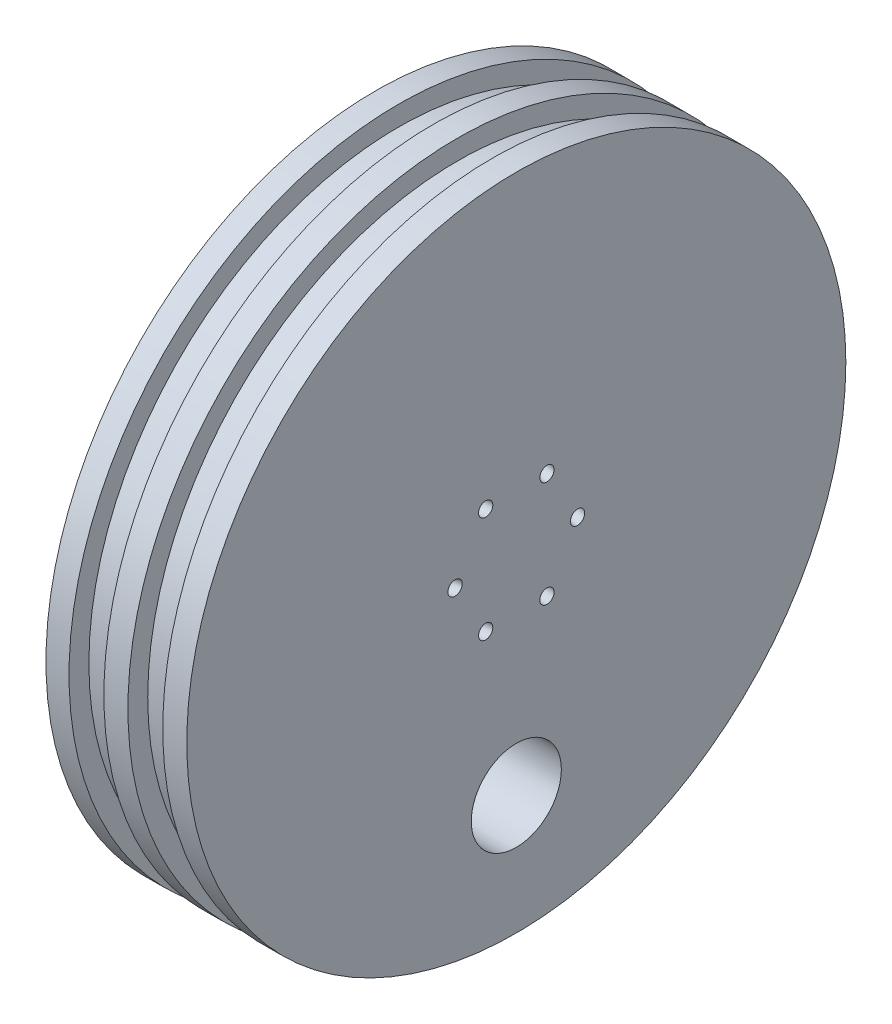
ISO-10303-21;
HEADER;
FILE_DESCRIPTION(('STEP AP214'),'2;1');
FILE_NAME('part.step','',(''),(''),'','','');
FILE_SCHEMA(('AUTOMOTIVE_DESIGN { 1 0 10303 214 1 1 1 1 }'));
ENDSEC;
DATA;
#1=APPLICATION_CONTEXT('core data for automotive mechanical design processes');
#2=APPLICATION_PROTOCOL_DEFINITION('international standard','automotive_design',2000,#1);
#3=PRODUCT_CONTEXT('',#1,'mechanical');
#4=PRODUCT('Part','Part','',(#3));
#5=PRODUCT_RELATED_PRODUCT_CATEGORY('part','',(#4));
#6=PRODUCT_DEFINITION_FORMATION('','',#4);
#7=PRODUCT_DEFINITION_CONTEXT('part definition',#1,'design');
#8=PRODUCT_DEFINITION('design','',#6,#7);
#9=PRODUCT_DEFINITION_SHAPE('','',#8);
#10=(LENGTH_UNIT() NAMED_UNIT(*) SI_UNIT(.MILLI.,.METRE.));
#11=(NAMED_UNIT(*) PLANE_ANGLE_UNIT() SI_UNIT($,.RADIAN.));
#12=(NAMED_UNIT(*) SI_UNIT($,.STERADIAN.) SOLID_ANGLE_UNIT());
#13=UNCERTAINTY_MEASURE_WITH_UNIT(LENGTH_MEASURE(1.E-05),#10,'distance_accuracy_value','');
#14=(GEOMETRIC_REPRESENTATION_CONTEXT(3) GLOBAL_UNCERTAINTY_ASSIGNED_CONTEXT((#13)) GLOBAL_UNIT_ASSIGNED_CONTEXT((#10,
#11,#12)) REPRESENTATION_CONTEXT('',''));
#15=CARTESIAN_POINT('',(0.,0.,0.));
#16=DIRECTION('',(0.,0.,1.));
#17=DIRECTION('',(1.,0.,0.));
#18=AXIS2_PLACEMENT_3D('',#15,#16,#17);
#19=CARTESIAN_POINT('',(-18.06,0.,0.));
#20=DIRECTION('',(-1.,0.,0.));
#21=DIRECTION('',(0.,0.,1.));
#22=AXIS2_PLACEMENT_3D('',#19,#20,#21);
#23=PLANE('',#22);
#24=CARTESIAN_POINT('',(-18.06,-22.225,-1.52655665885959E-13));
#25=DIRECTION('',(-1.,0.,0.));
#26=DIRECTION('',(0.,0.,1.));
#27=AXIS2_PLACEMENT_3D('',#24,#25,#26);
#28=CIRCLE('',#27,4.21639999999999);
#29=CARTESIAN_POINT('',(-18.06,-22.225,4.21639999999984));
#30=VERTEX_POINT('',#29);
#31=EDGE_CURVE('E82',#30,#30,#28,.T.);
#32=ORIENTED_EDGE('',*,*,#31,.F.);
#33=EDGE_LOOP('',(#32));
#34=FACE_BOUND('',#33,.T.);
#35=CARTESIAN_POINT('',(-18.06,11.3347499999999,19.6323628910914));
#36=DIRECTION('',(-1.,0.,0.));
#37=DIRECTION('',(0.,0.,1.));
#38=AXIS2_PLACEMENT_3D('',#35,#36,#37);
#39=CIRCLE('',#38,0.888999999999989);
#40=CARTESIAN_POINT('',(-18.06,11.3347499999999,20.5213628910913));
#41=VERTEX_POINT('',#40);
#42=EDGE_CURVE('E76',#41,#41,#39,.T.);
#43=ORIENTED_EDGE('',*,*,#42,.F.);
#44=EDGE_LOOP('',(#43));
#45=FACE_BOUND('',#44,.T.);
#46=CARTESIAN_POINT('',(-18.06,-7.03945803644227,-5.71569897686727));
#47=DIRECTION('',(-1.,0.,0.));
#48=DIRECTION('',(0.,0.499999999999989,0.866025403784445));
#49=AXIS2_PLACEMENT_3D('',#46,#47,#48);
#50=ELLIPSE('',#49,0.759348844340994,0.749999999999992);
#51=CARTESIAN_POINT('',(-18.06,-6.65978361427178,-5.05808358733361));
#52=VERTEX_POINT('',#51);
#53=EDGE_CURVE('E88',#52,#52,#50,.F.);
#54=ORIENTED_EDGE('',*,*,#53,.T.);
#55=EDGE_LOOP('',(#54));
#56=FACE_BOUND('',#55,.T.);
#57=CARTESIAN_POINT('',(-18.06,-8.4696695325729,3.23849999999995));
#58=DIRECTION('',(-1.,0.,0.));
#59=DIRECTION('',(0.,1.,0.));
#60=AXIS2_PLACEMENT_3D('',#57,#58,#59);
#61=ELLIPSE('',#60,0.759348844340993,0.749999999999991);
#62=CARTESIAN_POINT('',(-18.06,-7.71032068823191,3.23849999999995));
#63=VERTEX_POINT('',#62);
#64=EDGE_CURVE('E92',#63,#63,#61,.F.);
#65=ORIENTED_EDGE('',*,*,#64,.T.);
#66=EDGE_LOOP('',(#65));
#67=FACE_BOUND('',#66,.T.);
#68=CARTESIAN_POINT('',(-18.06,0.,0.));
#69=DIRECTION('',(1.,0.,0.));
#70=DIRECTION('',(0.,0.,-1.));
#71=AXIS2_PLACEMENT_3D('',#68,#69,#70);
#72=CIRCLE('',#71,29.1592);
#73=CARTESIAN_POINT('',(-18.06,0.,-29.1592));
#74=VERTEX_POINT('',#73);
#75=EDGE_CURVE('E48',#74,#74,#72,.T.);
#76=ORIENTED_EDGE('',*,*,#75,.F.);
#77=EDGE_LOOP('',(#76));
#78=FACE_BOUND('',#77,.T.);
#79=CARTESIAN_POINT('',(-18.06,0.,0.));
#80=DIRECTION('',(1.,0.,0.));
#81=DIRECTION('',(0.,0.,-1.));
#82=AXIS2_PLACEMENT_3D('',#79,#80,#81);
#83=CIRCLE('',#82,4.7625);
#84=CARTESIAN_POINT('',(-18.06,0.,-4.7625));
#85=VERTEX_POINT('',#84);
#86=EDGE_CURVE('E169',#85,#85,#83,.T.);
#87=ORIENTED_EDGE('',*,*,#86,.T.);
#88=EDGE_LOOP('',(#87));
#89=FACE_BOUND('',#88,.T.);
#90=CARTESIAN_POINT('',(-18.06,22.225,0.));
#91=DIRECTION('',(-1.,0.,0.));
#92=DIRECTION('',(0.,0.,1.));
#93=AXIS2_PLACEMENT_3D('',#90,#91,#92);
#94=CIRCLE('',#93,2.0447);
#95=CARTESIAN_POINT('',(-18.06,22.225,2.0447));
#96=VERTEX_POINT('',#95);
#97=EDGE_CURVE('E130',#96,#96,#94,.T.);
#98=ORIENTED_EDGE('',*,*,#97,.F.);
#99=EDGE_LOOP('',(#98));
#100=FACE_BOUND('',#99,.T.);
#101=CARTESIAN_POINT('',(-18.06,-11.1125000000001,19.2474145991091));
#102=DIRECTION('',(-1.,0.,0.));
#103=DIRECTION('',(0.,0.,1.));
#104=AXIS2_PLACEMENT_3D('',#101,#102,#103);
#105=CIRCLE('',#104,2.0447);
#106=CARTESIAN_POINT('',(-18.06,-11.1125000000001,21.2921145991091));
#107=VERTEX_POINT('',#106);
#108=EDGE_CURVE('E124',#107,#107,#105,.T.);
#109=ORIENTED_EDGE('',*,*,#108,.F.);
#110=EDGE_LOOP('',(#109));
#111=FACE_BOUND('',#110,.T.);
#112=CARTESIAN_POINT('',(-18.06,-11.1124999999998,-19.2474145991092));
#113=DIRECTION('',(-1.,0.,0.));
#114=DIRECTION('',(0.,0.,1.));
#115=AXIS2_PLACEMENT_3D('',#112,#113,#114);
#116=CIRCLE('',#115,2.0447);
#117=CARTESIAN_POINT('',(-18.06,-11.1124999999998,-17.2027145991092));
#118=VERTEX_POINT('',#117);
#119=EDGE_CURVE('E118',#118,#118,#116,.T.);
#120=ORIENTED_EDGE('',*,*,#119,.F.);
#121=EDGE_LOOP('',(#120));
#122=FACE_BOUND('',#121,.T.);
#123=CARTESIAN_POINT('',(-18.06,1.43021149613054,-8.95419897686718));
#124=DIRECTION('',(-1.,0.,0.));
#125=DIRECTION('',(0.,-0.500000000000001,0.866025403784438));
#126=AXIS2_PLACEMENT_3D('',#123,#124,#125);
#127=ELLIPSE('',#126,0.759348844340993,0.749999999999991);
#128=CARTESIAN_POINT('',(-18.06,1.05053707396004,-8.29658358733353));
#129=VERTEX_POINT('',#128);
#130=EDGE_CURVE('E112',#129,#129,#127,.F.);
#131=ORIENTED_EDGE('',*,*,#130,.T.);
#132=EDGE_LOOP('',(#131));
#133=FACE_BOUND('',#132,.T.);
#134=CARTESIAN_POINT('',(-18.06,8.46966953257289,-3.23849999999999));
#135=DIRECTION('',(-1.,0.,0.));
#136=DIRECTION('',(0.,-1.,0.));
#137=AXIS2_PLACEMENT_3D('',#134,#135,#136);
#138=ELLIPSE('',#137,0.759348844340993,0.749999999999991);
#139=CARTESIAN_POINT('',(-18.06,7.71032068823189,-3.23849999999999));
#140=VERTEX_POINT('',#139);
#141=EDGE_CURVE('E106',#140,#140,#138,.F.);
#142=ORIENTED_EDGE('',*,*,#141,.T.);
#143=EDGE_LOOP('',(#142));
#144=FACE_BOUND('',#143,.T.);
#145=CARTESIAN_POINT('',(-18.06,7.03945803644231,5.71569897686722));
#146=DIRECTION('',(-1.,0.,0.));
#147=DIRECTION('',(0.,-0.499999999999995,-0.866025403784442));
#148=AXIS2_PLACEMENT_3D('',#145,#146,#147);
#149=ELLIPSE('',#148,0.759348844340994,0.749999999999992);
#150=CARTESIAN_POINT('',(-18.06,6.65978361427182,5.05808358733356));
#151=VERTEX_POINT('',#150);
#152=EDGE_CURVE('E102',#151,#151,#149,.F.);
#153=ORIENTED_EDGE('',*,*,#152,.T.);
#154=EDGE_LOOP('',(#153));
#155=FACE_BOUND('',#154,.T.);
#156=CARTESIAN_POINT('',(-18.06,-1.43021149613054,8.95419897686718));
#157=DIRECTION('',(-1.,0.,0.));
#158=DIRECTION('',(0.,0.500000000000001,-0.866025403784438));
#159=AXIS2_PLACEMENT_3D('',#156,#157,#158);
#160=ELLIPSE('',#159,0.759348844340993,0.749999999999991);
#161=CARTESIAN_POINT('',(-18.06,-1.05053707396004,8.29658358733353));
#162=VERTEX_POINT('',#161);
#163=EDGE_CURVE('E96',#162,#162,#160,.F.);
#164=ORIENTED_EDGE('',*,*,#163,.T.);
#165=EDGE_LOOP('',(#164));
#166=FACE_BOUND('',#165,.T.);
#167=ADVANCED_FACE('F39',(#34,#45,#56,#67,#78,#89,#100,#111,#122,#133,#144,#155,#166),#23,.T.);
#168=CARTESIAN_POINT('',(-14.885,0.,0.));
#169=DIRECTION('',(-1.,0.,0.));
#170=DIRECTION('',(0.,0.,1.));
#171=AXIS2_PLACEMENT_3D('',#168,#169,#170);
#172=PLANE('',#171);
#173=CARTESIAN_POINT('',(-14.885,0.,0.));
#174=DIRECTION('',(1.,0.,0.));
#175=DIRECTION('',(0.,0.,-1.));
#176=AXIS2_PLACEMENT_3D('',#173,#174,#175);
#177=CIRCLE('',#176,29.1592);
#178=CARTESIAN_POINT('',(-14.885,0.,-29.1592));
#179=VERTEX_POINT('',#178);
#180=EDGE_CURVE('E11',#179,#179,#177,.T.);
#181=ORIENTED_EDGE('',*,*,#180,.T.);
#182=EDGE_LOOP('',(#181));
#183=FACE_BOUND('',#182,.T.);
#184=CARTESIAN_POINT('',(-14.885,0.,0.));
#185=DIRECTION('',(1.,0.,0.));
#186=DIRECTION('',(0.,0.,-1.));
#187=AXIS2_PLACEMENT_3D('',#184,#185,#186);
#188=CIRCLE('',#187,34.8361);
#189=CARTESIAN_POINT('',(-14.885,0.,-34.8361));
#190=VERTEX_POINT('',#189);
#191=EDGE_CURVE('E136',#190,#190,#188,.T.);
#192=ORIENTED_EDGE('',*,*,#191,.F.);
#193=EDGE_LOOP('',(#192));
#194=FACE_BOUND('',#193,.T.);
#195=ADVANCED_FACE('F41',(#183,#194),#172,.T.);
#196=CARTESIAN_POINT('',(17.7798798469095,0.,0.));
#197=DIRECTION('',(1.,0.,0.));
#198=DIRECTION('',(0.,0.,-1.));
#199=AXIS2_PLACEMENT_3D('',#196,#197,#198);
#200=CYLINDRICAL_SURFACE('',#199,29.1592);
#201=ORIENTED_EDGE('',*,*,#75,.T.);
#202=EDGE_LOOP('',(#201));
#203=FACE_BOUND('',#202,.T.);
#204=ORIENTED_EDGE('',*,*,#180,.F.);
#205=EDGE_LOOP('',(#204));
#206=FACE_BOUND('',#205,.T.);
#207=ADVANCED_FACE('F218',(#203,#206),#200,.T.);
#208=CARTESIAN_POINT('',(17.7798798469095,0.,0.));
#209=DIRECTION('',(1.,0.,0.));
#210=DIRECTION('',(0.,0.,-1.));
#211=AXIS2_PLACEMENT_3D('',#208,#209,#210);
#212=CYLINDRICAL_SURFACE('',#211,4.7625);
#213=CARTESIAN_POINT('',(-12.599,0.,0.));
#214=DIRECTION('',(1.,0.,0.));
#215=DIRECTION('',(0.,0.,-1.));
#216=AXIS2_PLACEMENT_3D('',#213,#214,#215);
#217=CIRCLE('',#216,4.7625);
#218=CARTESIAN_POINT('',(-12.599,0.,-4.7625));
#219=VERTEX_POINT('',#218);
#220=EDGE_CURVE('E166',#219,#219,#217,.T.);
#221=ORIENTED_EDGE('',*,*,#220,.T.);
#222=EDGE_LOOP('',(#221));
#223=FACE_BOUND('',#222,.T.);
#224=ORIENTED_EDGE('',*,*,#86,.F.);
#225=EDGE_LOOP('',(#224));
#226=FACE_BOUND('',#225,.T.);
#227=ADVANCED_FACE('F223',(#223,#226),#212,.F.);
#228=CARTESIAN_POINT('',(-12.599,0.,0.));
#229=DIRECTION('',(-1.,0.,0.));
#230=DIRECTION('',(0.,0.,1.));
#231=AXIS2_PLACEMENT_3D('',#228,#229,#230);
#232=PLANE('',#231);
#233=CARTESIAN_POINT('',(-12.599,0.,0.));
#234=DIRECTION('',(-1.,0.,0.));
#235=DIRECTION('',(0.,0.,1.));
#236=AXIS2_PLACEMENT_3D('',#233,#234,#235);
#237=CIRCLE('',#236,1.7272);
#238=CARTESIAN_POINT('',(-12.599,0.,1.7272));
#239=VERTEX_POINT('',#238);
#240=EDGE_CURVE('E75',#239,#239,#237,.T.);
#241=ORIENTED_EDGE('',*,*,#240,.F.);
#242=EDGE_LOOP('',(#241));
#243=FACE_BOUND('',#242,.T.);
#244=ORIENTED_EDGE('',*,*,#220,.F.);
#245=EDGE_LOOP('',(#244));
#246=FACE_BOUND('',#245,.T.);
#247=ADVANCED_FACE('F187',(#243,#246),#232,.T.);
#248=CARTESIAN_POINT('',(0.,0.,0.));
#249=DIRECTION('',(1.,0.,0.));
#250=DIRECTION('',(0.,0.,-1.));
#251=AXIS2_PLACEMENT_3D('',#248,#249,#250);
#252=PLANE('',#251);
#253=CARTESIAN_POINT('',(0.,-22.225,-1.52655665885959E-13));
#254=DIRECTION('',(1.,0.,0.));
#255=DIRECTION('',(0.,0.,-1.));
#256=AXIS2_PLACEMENT_3D('',#253,#254,#255);
#257=CIRCLE('',#256,4.7625);
#258=CARTESIAN_POINT('',(0.,-22.225,-4.76250000000015));
#259=VERTEX_POINT('',#258);
#260=EDGE_CURVE('E354',#259,#259,#257,.T.);
#261=ORIENTED_EDGE('',*,*,#260,.F.);
#262=EDGE_LOOP('',(#261));
#263=FACE_BOUND('',#262,.T.);
#264=CARTESIAN_POINT('',(0.,-5.60924654031177,-3.23850000000006));
#265=DIRECTION('',(1.,0.,0.));
#266=DIRECTION('',(0.,0.499999999999989,0.866025403784445));
#267=AXIS2_PLACEMENT_3D('',#264,#265,#266);
#268=ELLIPSE('',#267,0.759348844340994,0.749999999999992);
#269=CARTESIAN_POINT('',(0.,-5.22957211814128,-2.5808846104664));
#270=VERTEX_POINT('',#269);
#271=EDGE_CURVE('E91',#270,#270,#268,.T.);
#272=ORIENTED_EDGE('',*,*,#271,.F.);
#273=EDGE_LOOP('',(#272));
#274=FACE_BOUND('',#273,.T.);
#275=CARTESIAN_POINT('',(0.,-5.60924654031184,3.23849999999995));
#276=DIRECTION('',(1.,0.,0.));
#277=DIRECTION('',(0.,1.,0.));
#278=AXIS2_PLACEMENT_3D('',#275,#276,#277);
#279=ELLIPSE('',#278,0.759348844340993,0.749999999999991);
#280=CARTESIAN_POINT('',(0.,-4.84989769597084,3.23849999999995));
#281=VERTEX_POINT('',#280);
#282=EDGE_CURVE('E95',#281,#281,#279,.T.);
#283=ORIENTED_EDGE('',*,*,#282,.F.);
#284=EDGE_LOOP('',(#283));
#285=FACE_BOUND('',#284,.T.);
#286=CARTESIAN_POINT('',(0.,0.,6.477));
#287=DIRECTION('',(1.,0.,0.));
#288=DIRECTION('',(0.,0.500000000000001,-0.866025403784438));
#289=AXIS2_PLACEMENT_3D('',#286,#287,#288);
#290=ELLIPSE('',#289,0.759348844340993,0.749999999999991);
#291=CARTESIAN_POINT('',(0.,0.379674422170497,5.81938461046634));
#292=VERTEX_POINT('',#291);
#293=EDGE_CURVE('E99',#292,#292,#290,.T.);
#294=ORIENTED_EDGE('',*,*,#293,.F.);
#295=EDGE_LOOP('',(#294));
#296=FACE_BOUND('',#295,.T.);
#297=CARTESIAN_POINT('',(0.,5.60924654031179,3.23850000000003));
#298=DIRECTION('',(1.,0.,0.));
#299=DIRECTION('',(0.,-0.499999999999995,-0.866025403784442));
#300=AXIS2_PLACEMENT_3D('',#297,#298,#299);
#301=ELLIPSE('',#300,0.759348844340994,0.749999999999992);
#302=CARTESIAN_POINT('',(0.,5.2295721181413,2.58088461046637));
#303=VERTEX_POINT('',#302);
#304=EDGE_CURVE('E105',#303,#303,#301,.T.);
#305=ORIENTED_EDGE('',*,*,#304,.F.);
#306=EDGE_LOOP('',(#305));
#307=FACE_BOUND('',#306,.T.);
#308=CARTESIAN_POINT('',(0.,5.60924654031182,-3.23849999999999));
#309=DIRECTION('',(1.,0.,0.));
#310=DIRECTION('',(0.,-1.,0.));
#311=AXIS2_PLACEMENT_3D('',#308,#309,#310);
#312=ELLIPSE('',#311,0.759348844340993,0.749999999999991);
#313=CARTESIAN_POINT('',(0.,4.84989769597082,-3.23849999999999));
#314=VERTEX_POINT('',#313);
#315=EDGE_CURVE('E109',#314,#314,#312,.T.);
#316=ORIENTED_EDGE('',*,*,#315,.F.);
#317=EDGE_LOOP('',(#316));
#318=FACE_BOUND('',#317,.T.);
#319=CARTESIAN_POINT('',(0.,0.,-6.477));
#320=DIRECTION('',(1.,0.,0.));
#321=DIRECTION('',(0.,-0.500000000000001,0.866025403784438));
#322=AXIS2_PLACEMENT_3D('',#319,#320,#321);
#323=ELLIPSE('',#322,0.759348844340993,0.749999999999991);
#324=CARTESIAN_POINT('',(0.,-0.379674422170497,-5.81938461046634));
#325=VERTEX_POINT('',#324);
#326=EDGE_CURVE('E115',#325,#325,#323,.T.);
#327=ORIENTED_EDGE('',*,*,#326,.F.);
#328=EDGE_LOOP('',(#327));
#329=FACE_BOUND('',#328,.T.);
#330=CARTESIAN_POINT('',(0.,0.,0.));
#331=DIRECTION('',(1.,0.,0.));
#332=DIRECTION('',(0.,0.,-1.));
#333=AXIS2_PLACEMENT_3D('',#330,#331,#332);
#334=CIRCLE('',#333,34.8361);
#335=CARTESIAN_POINT('',(0.,0.,-34.8361));
#336=VERTEX_POINT('',#335);
#337=EDGE_CURVE('E163',#336,#336,#334,.T.);
#338=ORIENTED_EDGE('',*,*,#337,.T.);
#339=EDGE_LOOP('',(#338));
#340=FACE_BOUND('',#339,.T.);
#341=ADVANCED_FACE('F183',(#263,#274,#285,#296,#307,#318,#329,#340),#252,.T.);
#342=CARTESIAN_POINT('',(17.7798798469095,0.,0.));
#343=DIRECTION('',(1.,0.,0.));
#344=DIRECTION('',(0.,0.,-1.));
#345=AXIS2_PLACEMENT_3D('',#342,#343,#344);
#346=CYLINDRICAL_SURFACE('',#345,34.8361);
#347=CARTESIAN_POINT('',(-2.53999999999999,0.,0.));
#348=DIRECTION('',(1.,0.,0.));
#349=DIRECTION('',(0.,0.,-1.));
#350=AXIS2_PLACEMENT_3D('',#347,#348,#349);
#351=CIRCLE('',#350,34.8361);
#352=CARTESIAN_POINT('',(-2.53999999999999,0.,-34.8361));
#353=VERTEX_POINT('',#352);
#354=EDGE_CURVE('E160',#353,#353,#351,.T.);
#355=ORIENTED_EDGE('',*,*,#354,.T.);
#356=EDGE_LOOP('',(#355));
#357=FACE_BOUND('',#356,.T.);
#358=ORIENTED_EDGE('',*,*,#337,.F.);
#359=EDGE_LOOP('',(#358));
#360=FACE_BOUND('',#359,.T.);
#361=ADVANCED_FACE('F186',(#357,#360),#346,.T.);
#362=CARTESIAN_POINT('',(-2.53999999999999,0.,0.));
#363=DIRECTION('',(-1.,0.,0.));
#364=DIRECTION('',(0.,0.,1.));
#365=AXIS2_PLACEMENT_3D('',#362,#363,#364);
#366=PLANE('',#365);
#367=CARTESIAN_POINT('',(-2.53999999999999,0.,0.));
#368=DIRECTION('',(1.,0.,0.));
#369=DIRECTION('',(0.,0.,-1.));
#370=AXIS2_PLACEMENT_3D('',#367,#368,#369);
#371=CIRCLE('',#370,32.7406);
#372=CARTESIAN_POINT('',(-2.53999999999999,0.,-32.7406));
#373=VERTEX_POINT('',#372);
#374=EDGE_CURVE('E157',#373,#373,#371,.T.);
#375=ORIENTED_EDGE('',*,*,#374,.T.);
#376=EDGE_LOOP('',(#375));
#377=FACE_BOUND('',#376,.T.);
#378=ORIENTED_EDGE('',*,*,#354,.F.);
#379=EDGE_LOOP('',(#378));
#380=FACE_BOUND('',#379,.T.);
#381=ADVANCED_FACE('F203',(#377,#380),#366,.T.);
#382=CARTESIAN_POINT('',(17.7798798469095,0.,0.));
#383=DIRECTION('',(1.,0.,0.));
#384=DIRECTION('',(0.,0.,-1.));
#385=AXIS2_PLACEMENT_3D('',#382,#383,#384);
#386=CYLINDRICAL_SURFACE('',#385,32.7406);
#387=CARTESIAN_POINT('',(-6.223,0.,0.));
#388=DIRECTION('',(1.,0.,0.));
#389=DIRECTION('',(0.,0.,-1.));
#390=AXIS2_PLACEMENT_3D('',#387,#388,#389);
#391=CIRCLE('',#390,32.7406);
#392=CARTESIAN_POINT('',(-6.223,0.,-32.7406));
#393=VERTEX_POINT('',#392);
#394=EDGE_CURVE('E154',#393,#393,#391,.T.);
#395=ORIENTED_EDGE('',*,*,#394,.T.);
#396=EDGE_LOOP('',(#395));
#397=FACE_BOUND('',#396,.T.);
#398=ORIENTED_EDGE('',*,*,#374,.F.);
#399=EDGE_LOOP('',(#398));
#400=FACE_BOUND('',#399,.T.);
#401=ADVANCED_FACE('F209',(#397,#400),#386,.T.);
#402=CARTESIAN_POINT('',(-6.22299999999999,0.,0.));
#403=DIRECTION('',(1.,0.,0.));
#404=DIRECTION('',(0.,0.,-1.));
#405=AXIS2_PLACEMENT_3D('',#402,#403,#404);
#406=PLANE('',#405);
#407=CARTESIAN_POINT('',(-6.22299999999999,0.,0.));
#408=DIRECTION('',(1.,0.,0.));
#409=DIRECTION('',(0.,0.,-1.));
#410=AXIS2_PLACEMENT_3D('',#407,#408,#409);
#411=CIRCLE('',#410,34.8361);
#412=CARTESIAN_POINT('',(-6.22299999999999,0.,-34.8361));
#413=VERTEX_POINT('',#412);
#414=EDGE_CURVE('E151',#413,#413,#411,.T.);
#415=ORIENTED_EDGE('',*,*,#414,.T.);
#416=EDGE_LOOP('',(#415));
#417=FACE_BOUND('',#416,.T.);
#418=ORIENTED_EDGE('',*,*,#394,.F.);
#419=EDGE_LOOP('',(#418));
#420=FACE_BOUND('',#419,.T.);
#421=ADVANCED_FACE('F265',(#417,#420),#406,.T.);
#422=CARTESIAN_POINT('',(17.7798798469095,0.,0.));
#423=DIRECTION('',(1.,0.,0.));
#424=DIRECTION('',(0.,0.,-1.));
#425=AXIS2_PLACEMENT_3D('',#422,#423,#424);
#426=CYLINDRICAL_SURFACE('',#425,34.8361);
#427=CARTESIAN_POINT('',(-8.76299999999999,0.,0.));
#428=DIRECTION('',(1.,0.,0.));
#429=DIRECTION('',(0.,0.,-1.));
#430=AXIS2_PLACEMENT_3D('',#427,#428,#429);
#431=CIRCLE('',#430,34.8361);
#432=CARTESIAN_POINT('',(-8.76299999999999,0.,-34.8361));
#433=VERTEX_POINT('',#432);
#434=EDGE_CURVE('E148',#433,#433,#431,.T.);
#435=ORIENTED_EDGE('',*,*,#434,.T.);
#436=EDGE_LOOP('',(#435));
#437=FACE_BOUND('',#436,.T.);
#438=ORIENTED_EDGE('',*,*,#414,.F.);
#439=EDGE_LOOP('',(#438));
#440=FACE_BOUND('',#439,.T.);
#441=ADVANCED_FACE('F259',(#437,#440),#426,.T.);
#442=CARTESIAN_POINT('',(-8.76299999999999,0.,0.));
#443=DIRECTION('',(-1.,0.,0.));
#444=DIRECTION('',(0.,0.,1.));
#445=AXIS2_PLACEMENT_3D('',#442,#443,#444);
#446=PLANE('',#445);
#447=CARTESIAN_POINT('',(-8.76299999999999,0.,0.));
#448=DIRECTION('',(1.,0.,0.));
#449=DIRECTION('',(0.,0.,-1.));
#450=AXIS2_PLACEMENT_3D('',#447,#448,#449);
#451=CIRCLE('',#450,32.7406);
#452=CARTESIAN_POINT('',(-8.76299999999999,0.,-32.7406));
#453=VERTEX_POINT('',#452);
#454=EDGE_CURVE('E145',#453,#453,#451,.T.);
#455=ORIENTED_EDGE('',*,*,#454,.T.);
#456=EDGE_LOOP('',(#455));
#457=FACE_BOUND('',#456,.T.);
#458=ORIENTED_EDGE('',*,*,#434,.F.);
#459=EDGE_LOOP('',(#458));
#460=FACE_BOUND('',#459,.T.);
#461=ADVANCED_FACE('F253',(#457,#460),#446,.T.);
#462=CARTESIAN_POINT('',(17.7798798469095,0.,0.));
#463=DIRECTION('',(1.,0.,0.));
#464=DIRECTION('',(0.,0.,-1.));
#465=AXIS2_PLACEMENT_3D('',#462,#463,#464);
#466=CYLINDRICAL_SURFACE('',#465,32.7406);
#467=CARTESIAN_POINT('',(-12.446,0.,0.));
#468=DIRECTION('',(1.,0.,0.));
#469=DIRECTION('',(0.,0.,-1.));
#470=AXIS2_PLACEMENT_3D('',#467,#468,#469);
#471=CIRCLE('',#470,32.7406);
#472=CARTESIAN_POINT('',(-12.446,0.,-32.7406));
#473=VERTEX_POINT('',#472);
#474=EDGE_CURVE('E142',#473,#473,#471,.T.);
#475=ORIENTED_EDGE('',*,*,#474,.T.);
#476=EDGE_LOOP('',(#475));
#477=FACE_BOUND('',#476,.T.);
#478=ORIENTED_EDGE('',*,*,#454,.F.);
#479=EDGE_LOOP('',(#478));
#480=FACE_BOUND('',#479,.T.);
#481=ADVANCED_FACE('F247',(#477,#480),#466,.T.);
#482=CARTESIAN_POINT('',(-12.446,0.,0.));
#483=DIRECTION('',(1.,0.,0.));
#484=DIRECTION('',(0.,0.,-1.));
#485=AXIS2_PLACEMENT_3D('',#482,#483,#484);
#486=PLANE('',#485);
#487=CARTESIAN_POINT('',(-12.446,0.,0.));
#488=DIRECTION('',(1.,0.,0.));
#489=DIRECTION('',(0.,0.,-1.));
#490=AXIS2_PLACEMENT_3D('',#487,#488,#489);
#491=CIRCLE('',#490,34.8361);
#492=CARTESIAN_POINT('',(-12.446,0.,-34.8361));
#493=VERTEX_POINT('',#492);
#494=EDGE_CURVE('E139',#493,#493,#491,.T.);
#495=ORIENTED_EDGE('',*,*,#494,.T.);
#496=EDGE_LOOP('',(#495));
#497=FACE_BOUND('',#496,.T.);
#498=ORIENTED_EDGE('',*,*,#474,.F.);
#499=EDGE_LOOP('',(#498));
#500=FACE_BOUND('',#499,.T.);
#501=ADVANCED_FACE('F241',(#497,#500),#486,.T.);
#502=CARTESIAN_POINT('',(17.7798798469095,0.,0.));
#503=DIRECTION('',(1.,0.,0.));
#504=DIRECTION('',(0.,0.,-1.));
#505=AXIS2_PLACEMENT_3D('',#502,#503,#504);
#506=CYLINDRICAL_SURFACE('',#505,34.8361);
#507=ORIENTED_EDGE('',*,*,#191,.T.);
#508=EDGE_LOOP('',(#507));
#509=FACE_BOUND('',#508,.T.);
#510=ORIENTED_EDGE('',*,*,#494,.F.);
#511=EDGE_LOOP('',(#510));
#512=FACE_BOUND('',#511,.T.);
#513=ADVANCED_FACE('F237',(#509,#512),#506,.T.);
#514=CARTESIAN_POINT('',(-8.408,22.225,0.));
#515=DIRECTION('',(-1.,0.,0.));
#516=DIRECTION('',(0.,0.,1.));
#517=AXIS2_PLACEMENT_3D('',#514,#515,#516);
#518=CONICAL_SURFACE('',#517,2.0447,1.02974425867665);
#519=CARTESIAN_POINT('',(-7.17942029227434,22.225,0.));
#520=VERTEX_POINT('',#519);
#521=VERTEX_LOOP('',#520);
#522=FACE_BOUND('',#521,.T.);
#523=CARTESIAN_POINT('',(-8.408,22.225,0.));
#524=DIRECTION('',(-1.,0.,0.));
#525=DIRECTION('',(0.,0.,1.));
#526=AXIS2_PLACEMENT_3D('',#523,#524,#525);
#527=CIRCLE('',#526,2.0447);
#528=CARTESIAN_POINT('',(-8.408,22.225,2.0447));
#529=VERTEX_POINT('',#528);
#530=EDGE_CURVE('E133',#529,#529,#527,.T.);
#531=ORIENTED_EDGE('',*,*,#530,.T.);
#532=EDGE_LOOP('',(#531));
#533=FACE_BOUND('',#532,.T.);
#534=ADVANCED_FACE('F240',(#522,#533),#518,.F.);
#535=CARTESIAN_POINT('',(-18.06,22.225,0.));
#536=DIRECTION('',(-1.,0.,0.));
#537=DIRECTION('',(0.,0.,1.));
#538=AXIS2_PLACEMENT_3D('',#535,#536,#537);
#539=CYLINDRICAL_SURFACE('',#538,2.0447);
#540=ORIENTED_EDGE('',*,*,#530,.F.);
#541=EDGE_LOOP('',(#540));
#542=FACE_BOUND('',#541,.T.);
#543=ORIENTED_EDGE('',*,*,#97,.T.);
#544=EDGE_LOOP('',(#543));
#545=FACE_BOUND('',#544,.T.);
#546=ADVANCED_FACE('F285',(#542,#545),#539,.F.);
#547=CARTESIAN_POINT('',(-8.408,-11.1125000000001,19.2474145991091));
#548=DIRECTION('',(-1.,0.,0.));
#549=DIRECTION('',(0.,0.,1.));
#550=AXIS2_PLACEMENT_3D('',#547,#548,#549);
#551=CONICAL_SURFACE('',#550,2.0447,1.02974425867665);
#552=CARTESIAN_POINT('',(-7.17942029227434,-11.1125000000001,19.2474145991091));
#553=VERTEX_POINT('',#552);
#554=VERTEX_LOOP('',#553);
#555=FACE_BOUND('',#554,.T.);
#556=CARTESIAN_POINT('',(-8.408,-11.1125000000001,19.2474145991091));
#557=DIRECTION('',(-1.,0.,0.));
#558=DIRECTION('',(0.,0.,1.));
#559=AXIS2_PLACEMENT_3D('',#556,#557,#558);
#560=CIRCLE('',#559,2.0447);
#561=CARTESIAN_POINT('',(-8.408,-11.1125000000001,21.2921145991091));
#562=VERTEX_POINT('',#561);
#563=EDGE_CURVE('E127',#562,#562,#560,.T.);
#564=ORIENTED_EDGE('',*,*,#563,.T.);
#565=EDGE_LOOP('',(#564));
#566=FACE_BOUND('',#565,.T.);
#567=ADVANCED_FACE('F288',(#555,#566),#551,.F.);
#568=CARTESIAN_POINT('',(-18.06,-11.1125000000001,19.2474145991091));
#569=DIRECTION('',(-1.,0.,0.));
#570=DIRECTION('',(0.,0.,1.));
#571=AXIS2_PLACEMENT_3D('',#568,#569,#570);
#572=CYLINDRICAL_SURFACE('',#571,2.0447);
#573=ORIENTED_EDGE('',*,*,#563,.F.);
#574=EDGE_LOOP('',(#573));
#575=FACE_BOUND('',#574,.T.);
#576=ORIENTED_EDGE('',*,*,#108,.T.);
#577=EDGE_LOOP('',(#576));
#578=FACE_BOUND('',#577,.T.);
#579=ADVANCED_FACE('F292',(#575,#578),#572,.F.);
#580=CARTESIAN_POINT('',(-8.408,-11.1124999999998,-19.2474145991092));
#581=DIRECTION('',(-1.,0.,0.));
#582=DIRECTION('',(0.,0.,1.));
#583=AXIS2_PLACEMENT_3D('',#580,#581,#582);
#584=CONICAL_SURFACE('',#583,2.0447,1.02974425867665);
#585=CARTESIAN_POINT('',(-7.17942029227434,-11.1124999999998,-19.2474145991092));
#586=VERTEX_POINT('',#585);
#587=VERTEX_LOOP('',#586);
#588=FACE_BOUND('',#587,.T.);
#589=CARTESIAN_POINT('',(-8.408,-11.1124999999998,-19.2474145991092));
#590=DIRECTION('',(-1.,0.,0.));
#591=DIRECTION('',(0.,0.,1.));
#592=AXIS2_PLACEMENT_3D('',#589,#590,#591);
#593=CIRCLE('',#592,2.0447);
#594=CARTESIAN_POINT('',(-8.408,-11.1124999999998,-17.2027145991092));
#595=VERTEX_POINT('',#594);
#596=EDGE_CURVE('E121',#595,#595,#593,.T.);
#597=ORIENTED_EDGE('',*,*,#596,.T.);
#598=EDGE_LOOP('',(#597));
#599=FACE_BOUND('',#598,.T.);
#600=ADVANCED_FACE('F295',(#588,#599),#584,.F.);
#601=CARTESIAN_POINT('',(-18.06,-11.1124999999998,-19.2474145991092));
#602=DIRECTION('',(-1.,0.,0.));
#603=DIRECTION('',(0.,0.,1.));
#604=AXIS2_PLACEMENT_3D('',#601,#602,#603);
#605=CYLINDRICAL_SURFACE('',#604,2.0447);
#606=ORIENTED_EDGE('',*,*,#596,.F.);
#607=EDGE_LOOP('',(#606));
#608=FACE_BOUND('',#607,.T.);
#609=ORIENTED_EDGE('',*,*,#119,.T.);
#610=EDGE_LOOP('',(#609));
#611=FACE_BOUND('',#610,.T.);
#612=ADVANCED_FACE('F299',(#608,#611),#605,.F.);
#613=CARTESIAN_POINT('',(0.866676253297597,-0.0686340166605516,-6.35812239601639));
#614=DIRECTION('',(0.987688340595138,-0.0782172325201141,0.135476220752266));
#615=DIRECTION('',(0.135892549420801,0.,-0.9907235815362));
#616=AXIS2_PLACEMENT_3D('',#613,#614,#615);
#617=CYLINDRICAL_SURFACE('',#616,0.749999999999991);
#618=ORIENTED_EDGE('',*,*,#326,.T.);
#619=EDGE_LOOP('',(#618));
#620=FACE_BOUND('',#619,.T.);
#621=ORIENTED_EDGE('',*,*,#130,.F.);
#622=EDGE_LOOP('',(#621));
#623=FACE_BOUND('',#622,.T.);
#624=ADVANCED_FACE('F303',(#620,#623),#617,.F.);
#625=CARTESIAN_POINT('',(0.866676253297597,5.47197850699071,-3.23849999999999));
#626=DIRECTION('',(0.987688340595138,-0.156434465040228,0.));
#627=DIRECTION('',(0.156434465040228,0.987688340595138,0.));
#628=AXIS2_PLACEMENT_3D('',#625,#626,#627);
#629=CYLINDRICAL_SURFACE('',#628,0.749999999999991);
#630=ORIENTED_EDGE('',*,*,#315,.T.);
#631=EDGE_LOOP('',(#630));
#632=FACE_BOUND('',#631,.T.);
#633=ORIENTED_EDGE('',*,*,#141,.F.);
#634=EDGE_LOOP('',(#633));
#635=FACE_BOUND('',#634,.T.);
#636=ADVANCED_FACE('F307',(#632,#635),#629,.F.);
#637=CARTESIAN_POINT('',(0.866676253297597,5.54061252365124,3.11962239601642));
#638=DIRECTION('',(0.987688340595138,-0.0782172325201131,-0.135476220752266));
#639=DIRECTION('',(-0.135892549420801,0.,-0.9907235815362));
#640=AXIS2_PLACEMENT_3D('',#637,#638,#639);
#641=CYLINDRICAL_SURFACE('',#640,0.749999999999992);
#642=ORIENTED_EDGE('',*,*,#304,.T.);
#643=EDGE_LOOP('',(#642));
#644=FACE_BOUND('',#643,.T.);
#645=ORIENTED_EDGE('',*,*,#152,.F.);
#646=EDGE_LOOP('',(#645));
#647=FACE_BOUND('',#646,.T.);
#648=ADVANCED_FACE('F311',(#644,#647),#641,.F.);
#649=CARTESIAN_POINT('',(0.866676253297597,0.0686340166605516,6.35812239601639));
#650=DIRECTION('',(0.987688340595138,0.0782172325201141,-0.135476220752266));
#651=DIRECTION('',(-0.135892549420801,0.,-0.9907235815362));
#652=AXIS2_PLACEMENT_3D('',#649,#650,#651);
#653=CYLINDRICAL_SURFACE('',#652,0.749999999999991);
#654=ORIENTED_EDGE('',*,*,#293,.T.);
#655=EDGE_LOOP('',(#654));
#656=FACE_BOUND('',#655,.T.);
#657=ORIENTED_EDGE('',*,*,#163,.F.);
#658=EDGE_LOOP('',(#657));
#659=FACE_BOUND('',#658,.T.);
#660=ADVANCED_FACE('F315',(#656,#659),#653,.F.);
#661=CARTESIAN_POINT('',(0.866676253297597,-5.47197850699073,3.23849999999995));
#662=DIRECTION('',(0.987688340595138,0.156434465040228,0.));
#663=DIRECTION('',(-0.156434465040228,0.987688340595138,0.));
#664=AXIS2_PLACEMENT_3D('',#661,#662,#663);
#665=CYLINDRICAL_SURFACE('',#664,0.749999999999991);
#666=ORIENTED_EDGE('',*,*,#282,.T.);
#667=EDGE_LOOP('',(#666));
#668=FACE_BOUND('',#667,.T.);
#669=ORIENTED_EDGE('',*,*,#64,.F.);
#670=EDGE_LOOP('',(#669));
#671=FACE_BOUND('',#670,.T.);
#672=ADVANCED_FACE('F319',(#668,#671),#665,.F.);
#673=CARTESIAN_POINT('',(0.866676253297597,-5.54061252365122,-3.11962239601646));
#674=DIRECTION('',(0.987688340595138,0.0782172325201122,0.135476220752267));
#675=DIRECTION('',(0.135892549420802,0.,-0.9907235815362));
#676=AXIS2_PLACEMENT_3D('',#673,#674,#675);
#677=CYLINDRICAL_SURFACE('',#676,0.749999999999992);
#678=ORIENTED_EDGE('',*,*,#271,.T.);
#679=EDGE_LOOP('',(#678));
#680=FACE_BOUND('',#679,.T.);
#681=ORIENTED_EDGE('',*,*,#53,.F.);
#682=EDGE_LOOP('',(#681));
#683=FACE_BOUND('',#682,.T.);
#684=ADVANCED_FACE('F180',(#680,#683),#677,.F.);
#685=CARTESIAN_POINT('',(-6.249,0.,0.));
#686=DIRECTION('',(-1.,0.,0.));
#687=DIRECTION('',(0.,0.,1.));
#688=AXIS2_PLACEMENT_3D('',#685,#686,#687);
#689=CONICAL_SURFACE('',#688,1.7272,1.02974425867665);
#690=CARTESIAN_POINT('',(-5.2111935388156,0.,0.));
#691=VERTEX_POINT('',#690);
#692=VERTEX_LOOP('',#691);
#693=FACE_BOUND('',#692,.T.);
#694=CARTESIAN_POINT('',(-6.249,0.,0.));
#695=DIRECTION('',(-1.,0.,0.));
#696=DIRECTION('',(0.,0.,1.));
#697=AXIS2_PLACEMENT_3D('',#694,#695,#696);
#698=CIRCLE('',#697,1.7272);
#699=CARTESIAN_POINT('',(-6.249,0.,1.7272));
#700=VERTEX_POINT('',#699);
#701=EDGE_CURVE('E79',#700,#700,#698,.T.);
#702=ORIENTED_EDGE('',*,*,#701,.T.);
#703=EDGE_LOOP('',(#702));
#704=FACE_BOUND('',#703,.T.);
#705=ADVANCED_FACE('F326',(#693,#704),#689,.F.);
#706=CARTESIAN_POINT('',(-12.599,0.,0.));
#707=DIRECTION('',(-1.,0.,0.));
#708=DIRECTION('',(0.,0.,1.));
#709=AXIS2_PLACEMENT_3D('',#706,#707,#708);
#710=CYLINDRICAL_SURFACE('',#709,1.7272);
#711=ORIENTED_EDGE('',*,*,#701,.F.);
#712=EDGE_LOOP('',(#711));
#713=FACE_BOUND('',#712,.T.);
#714=ORIENTED_EDGE('',*,*,#240,.T.);
#715=EDGE_LOOP('',(#714));
#716=FACE_BOUND('',#715,.T.);
#717=ADVANCED_FACE('F69',(#713,#716),#710,.F.);
#718=CARTESIAN_POINT('',(-6.12199999999999,11.3347499999999,19.6323628910914));
#719=DIRECTION('',(-1.,0.,0.));
#720=DIRECTION('',(0.,0.,1.));
#721=AXIS2_PLACEMENT_3D('',#718,#719,#720);
#722=CONICAL_SURFACE('',#721,0.888999999999987,1.02974425867665);
#723=CARTESIAN_POINT('',(-5.5878349096845,11.3347499999999,19.6323628910914));
#724=VERTEX_POINT('',#723);
#725=VERTEX_LOOP('',#724);
#726=FACE_BOUND('',#725,.T.);
#727=CARTESIAN_POINT('',(-6.12199999999999,11.3347499999999,19.6323628910914));
#728=DIRECTION('',(-1.,0.,0.));
#729=DIRECTION('',(0.,0.,1.));
#730=AXIS2_PLACEMENT_3D('',#727,#728,#729);
#731=CIRCLE('',#730,0.888999999999987);
#732=CARTESIAN_POINT('',(-6.12199999999999,11.3347499999999,20.5213628910913));
#733=VERTEX_POINT('',#732);
#734=EDGE_CURVE('E73',#733,#733,#731,.T.);
#735=ORIENTED_EDGE('',*,*,#734,.T.);
#736=EDGE_LOOP('',(#735));
#737=FACE_BOUND('',#736,.T.);
#738=ADVANCED_FACE('F65',(#726,#737),#722,.F.);
#739=CARTESIAN_POINT('',(-18.06,11.3347499999999,19.6323628910914));
#740=DIRECTION('',(-1.,0.,0.));
#741=DIRECTION('',(0.,0.,1.));
#742=AXIS2_PLACEMENT_3D('',#739,#740,#741);
#743=CYLINDRICAL_SURFACE('',#742,0.888999999999988);
#744=ORIENTED_EDGE('',*,*,#734,.F.);
#745=EDGE_LOOP('',(#744));
#746=FACE_BOUND('',#745,.T.);
#747=ORIENTED_EDGE('',*,*,#42,.T.);
#748=EDGE_LOOP('',(#747));
#749=FACE_BOUND('',#748,.T.);
#750=ADVANCED_FACE('F68',(#746,#749),#743,.F.);
#751=CARTESIAN_POINT('',(-18.06,-22.225,-1.52655665885959E-13));
#752=DIRECTION('',(-1.,0.,0.));
#753=DIRECTION('',(0.,0.,1.));
#754=AXIS2_PLACEMENT_3D('',#751,#752,#753);
#755=CYLINDRICAL_SURFACE('',#754,4.21639999999999);
#756=CARTESIAN_POINT('',(-9.47212998405095,-22.225,-1.52655665885959E-13));
#757=DIRECTION('',(1.,0.,0.));
#758=DIRECTION('',(0.,0.,-1.));
#759=AXIS2_PLACEMENT_3D('',#756,#757,#758);
#760=CIRCLE('',#759,4.21639999999999);
#761=CARTESIAN_POINT('',(-9.47212998405095,-22.225,-4.21640000000015));
#762=VERTEX_POINT('',#761);
#763=EDGE_CURVE('E43',#762,#762,#760,.T.);
#764=ORIENTED_EDGE('',*,*,#763,.T.);
#765=EDGE_LOOP('',(#764));
#766=FACE_BOUND('',#765,.T.);
#767=ORIENTED_EDGE('',*,*,#31,.T.);
#768=EDGE_LOOP('',(#767));
#769=FACE_BOUND('',#768,.T.);
#770=ADVANCED_FACE('F335',(#766,#769),#755,.F.);
#771=CARTESIAN_POINT('',(-9.144,-22.225,-1.52655665885959E-13));
#772=DIRECTION('',(1.,0.,0.));
#773=DIRECTION('',(0.,0.,-1.));
#774=AXIS2_PLACEMENT_3D('',#771,#772,#773);
#775=CONICAL_SURFACE('',#774,4.7625,1.02974425867665);
#776=CARTESIAN_POINT('',(-9.144,-22.225,-1.52655665885959E-13));
#777=DIRECTION('',(1.,0.,0.));
#778=DIRECTION('',(0.,0.,-1.));
#779=AXIS2_PLACEMENT_3D('',#776,#777,#778);
#780=CIRCLE('',#779,4.7625);
#781=CARTESIAN_POINT('',(-9.144,-22.225,-4.76250000000015));
#782=VERTEX_POINT('',#781);
#783=EDGE_CURVE('E351',#782,#782,#780,.T.);
#784=ORIENTED_EDGE('',*,*,#783,.T.);
#785=EDGE_LOOP('',(#784));
#786=FACE_BOUND('',#785,.T.);
#787=ORIENTED_EDGE('',*,*,#763,.F.);
#788=EDGE_LOOP('',(#787));
#789=FACE_BOUND('',#788,.T.);
#790=ADVANCED_FACE('F338',(#786,#789),#775,.F.);
#791=CARTESIAN_POINT('',(0.,-22.225,-1.52655665885959E-13));
#792=DIRECTION('',(1.,0.,0.));
#793=DIRECTION('',(0.,0.,-1.));
#794=AXIS2_PLACEMENT_3D('',#791,#792,#793);
#795=CYLINDRICAL_SURFACE('',#794,4.7625);
#796=ORIENTED_EDGE('',*,*,#783,.F.);
#797=EDGE_LOOP('',(#796));
#798=FACE_BOUND('',#797,.T.);
#799=ORIENTED_EDGE('',*,*,#260,.T.);
#800=EDGE_LOOP('',(#799));
#801=FACE_BOUND('',#800,.T.);
#802=ADVANCED_FACE('F342',(#798,#801),#795,.F.);
#803=CLOSED_SHELL('',(#167,#195,#207,#227,#247,#341,#361,#381,#401,#421,#441,#461,#481,#501,
#513,#534,#546,#567,#579,#600,#612,#624,#636,#648,#660,#672,#684,#705,#717,#738,#750,#770,#790,#802));
#804=MANIFOLD_SOLID_BREP('B2',#803);
#805=ADVANCED_BREP_SHAPE_REPRESENTATION('',(#18,#804),#14);
#806=SHAPE_DEFINITION_REPRESENTATION(#9,#805);
ENDSEC;
END-ISO-10303-21;
